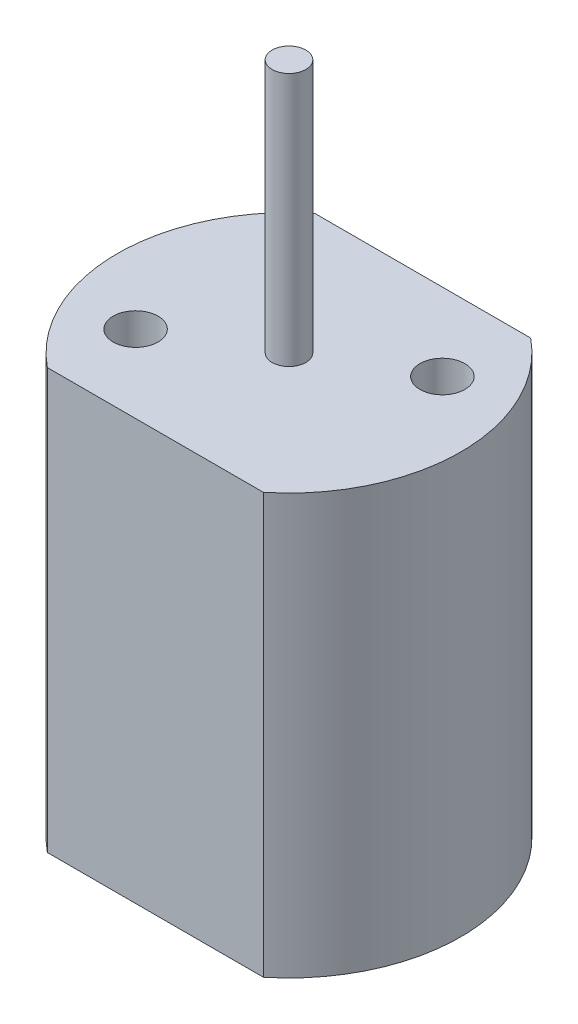
ISO-10303-21;
HEADER;
FILE_DESCRIPTION(('STEP AP214'),'2;1');
FILE_NAME('part.step','',(''),(''),'','','');
FILE_SCHEMA(('AUTOMOTIVE_DESIGN { 1 0 10303 214 1 1 1 1 }'));
ENDSEC;
DATA;
#1=APPLICATION_CONTEXT('core data for automotive mechanical design processes');
#2=APPLICATION_PROTOCOL_DEFINITION('international standard','automotive_design',2000,#1);
#3=PRODUCT_CONTEXT('',#1,'mechanical');
#4=PRODUCT('Part','Part','',(#3));
#5=PRODUCT_RELATED_PRODUCT_CATEGORY('part','',(#4));
#6=PRODUCT_DEFINITION_FORMATION('','',#4);
#7=PRODUCT_DEFINITION_CONTEXT('part definition',#1,'design');
#8=PRODUCT_DEFINITION('design','',#6,#7);
#9=PRODUCT_DEFINITION_SHAPE('','',#8);
#10=(LENGTH_UNIT() NAMED_UNIT(*) SI_UNIT(.MILLI.,.METRE.));
#11=(NAMED_UNIT(*) PLANE_ANGLE_UNIT() SI_UNIT($,.RADIAN.));
#12=(NAMED_UNIT(*) SI_UNIT($,.STERADIAN.) SOLID_ANGLE_UNIT());
#13=UNCERTAINTY_MEASURE_WITH_UNIT(LENGTH_MEASURE(1.E-05),#10,'distance_accuracy_value','');
#14=(GEOMETRIC_REPRESENTATION_CONTEXT(3) GLOBAL_UNCERTAINTY_ASSIGNED_CONTEXT((#13)) GLOBAL_UNIT_ASSIGNED_CONTEXT((#10,
#11,#12)) REPRESENTATION_CONTEXT('',''));
#15=CARTESIAN_POINT('',(0.,0.,0.));
#16=DIRECTION('',(0.,0.,1.));
#17=DIRECTION('',(1.,0.,0.));
#18=AXIS2_PLACEMENT_3D('',#15,#16,#17);
#19=CARTESIAN_POINT('',(0.,18.7,0.));
#20=DIRECTION('',(0.,-1.,0.));
#21=DIRECTION('',(0.,0.,-1.));
#22=AXIS2_PLACEMENT_3D('',#19,#20,#21);
#23=CYLINDRICAL_SURFACE('',#22,7.65);
#24=CARTESIAN_POINT('',(0.,0.,0.));
#25=DIRECTION('',(0.,1.,0.));
#26=DIRECTION('',(0.,0.,1.));
#27=AXIS2_PLACEMENT_3D('',#24,#25,#26);
#28=CIRCLE('',#27,7.65);
#29=CARTESIAN_POINT('',(4.80832611206852,0.,5.95));
#30=VERTEX_POINT('',#29);
#31=CARTESIAN_POINT('',(4.80832611206852,0.,-5.95));
#32=VERTEX_POINT('',#31);
#33=EDGE_CURVE('E112',#30,#32,#28,.T.);
#34=ORIENTED_EDGE('',*,*,#33,.T.);
#35=DIRECTION('',(0.,-1.,0.));
#36=VECTOR('',#35,1.);
#37=CARTESIAN_POINT('',(4.80832611206852,18.7,-5.95));
#38=LINE('',#37,#36);
#39=CARTESIAN_POINT('',(4.80832611206852,18.7,-5.95));
#40=VERTEX_POINT('',#39);
#41=EDGE_CURVE('E11',#40,#32,#38,.T.);
#42=ORIENTED_EDGE('',*,*,#41,.F.);
#43=CARTESIAN_POINT('',(0.,18.7,0.));
#44=DIRECTION('',(0.,1.,0.));
#45=DIRECTION('',(0.,0.,1.));
#46=AXIS2_PLACEMENT_3D('',#43,#44,#45);
#47=CIRCLE('',#46,7.65);
#48=CARTESIAN_POINT('',(4.80832611206852,18.7,5.95));
#49=VERTEX_POINT('',#48);
#50=EDGE_CURVE('E96',#49,#40,#47,.T.);
#51=ORIENTED_EDGE('',*,*,#50,.F.);
#52=DIRECTION('',(0.,-1.,0.));
#53=VECTOR('',#52,1.);
#54=CARTESIAN_POINT('',(4.80832611206852,18.7,5.95));
#55=LINE('',#54,#53);
#56=EDGE_CURVE('E108',#49,#30,#55,.T.);
#57=ORIENTED_EDGE('',*,*,#56,.T.);
#58=EDGE_LOOP('',(#34,#42,#51,#57));
#59=FACE_BOUND('',#58,.T.);
#60=ADVANCED_FACE('F44',(#59),#23,.T.);
#61=CARTESIAN_POINT('',(4.80832611206852,18.7,-5.95));
#62=DIRECTION('',(0.,0.,1.));
#63=DIRECTION('',(1.,0.,0.));
#64=AXIS2_PLACEMENT_3D('',#61,#62,#63);
#65=PLANE('',#64);
#66=DIRECTION('',(-1.,0.,0.));
#67=VECTOR('',#66,1.);
#68=CARTESIAN_POINT('',(4.80832611206852,0.,-5.95));
#69=LINE('',#68,#67);
#70=CARTESIAN_POINT('',(-4.80832611206852,0.,-5.95));
#71=VERTEX_POINT('',#70);
#72=EDGE_CURVE('E101',#32,#71,#69,.T.);
#73=ORIENTED_EDGE('',*,*,#72,.T.);
#74=DIRECTION('',(0.,-1.,0.));
#75=VECTOR('',#74,1.);
#76=CARTESIAN_POINT('',(-4.80832611206852,18.7,-5.95));
#77=LINE('',#76,#75);
#78=CARTESIAN_POINT('',(-4.80832611206852,18.7,-5.95));
#79=VERTEX_POINT('',#78);
#80=EDGE_CURVE('E53',#79,#71,#77,.T.);
#81=ORIENTED_EDGE('',*,*,#80,.F.);
#82=DIRECTION('',(-1.,0.,0.));
#83=VECTOR('',#82,1.);
#84=CARTESIAN_POINT('',(4.80832611206852,18.7,-5.95));
#85=LINE('',#84,#83);
#86=EDGE_CURVE('E91',#40,#79,#85,.T.);
#87=ORIENTED_EDGE('',*,*,#86,.F.);
#88=ORIENTED_EDGE('',*,*,#41,.T.);
#89=EDGE_LOOP('',(#73,#81,#87,#88));
#90=FACE_BOUND('',#89,.T.);
#91=ADVANCED_FACE('F100',(#90),#65,.F.);
#92=CARTESIAN_POINT('',(0.,18.7,0.));
#93=DIRECTION('',(0.,-1.,0.));
#94=DIRECTION('',(0.,0.,-1.));
#95=AXIS2_PLACEMENT_3D('',#92,#93,#94);
#96=CYLINDRICAL_SURFACE('',#95,7.65);
#97=CARTESIAN_POINT('',(0.,0.,0.));
#98=DIRECTION('',(0.,1.,0.));
#99=DIRECTION('',(0.,0.,1.));
#100=AXIS2_PLACEMENT_3D('',#97,#98,#99);
#101=CIRCLE('',#100,7.65);
#102=CARTESIAN_POINT('',(-4.80832611206852,0.,5.95));
#103=VERTEX_POINT('',#102);
#104=EDGE_CURVE('E78',#71,#103,#101,.T.);
#105=ORIENTED_EDGE('',*,*,#104,.T.);
#106=DIRECTION('',(0.,-1.,0.));
#107=VECTOR('',#106,1.);
#108=CARTESIAN_POINT('',(-4.80832611206852,18.7,5.95));
#109=LINE('',#108,#107);
#110=CARTESIAN_POINT('',(-4.80832611206852,18.7,5.95));
#111=VERTEX_POINT('',#110);
#112=EDGE_CURVE('E103',#111,#103,#109,.T.);
#113=ORIENTED_EDGE('',*,*,#112,.F.);
#114=CARTESIAN_POINT('',(0.,18.7,0.));
#115=DIRECTION('',(0.,1.,0.));
#116=DIRECTION('',(0.,0.,1.));
#117=AXIS2_PLACEMENT_3D('',#114,#115,#116);
#118=CIRCLE('',#117,7.65);
#119=EDGE_CURVE('E94',#79,#111,#118,.T.);
#120=ORIENTED_EDGE('',*,*,#119,.F.);
#121=ORIENTED_EDGE('',*,*,#80,.T.);
#122=EDGE_LOOP('',(#105,#113,#120,#121));
#123=FACE_BOUND('',#122,.T.);
#124=ADVANCED_FACE('F104',(#123),#96,.T.);
#125=CARTESIAN_POINT('',(4.80832611206852,18.7,5.95));
#126=DIRECTION('',(0.,0.,-1.));
#127=DIRECTION('',(-1.,0.,0.));
#128=AXIS2_PLACEMENT_3D('',#125,#126,#127);
#129=PLANE('',#128);
#130=DIRECTION('',(1.,0.,0.));
#131=VECTOR('',#130,1.);
#132=CARTESIAN_POINT('',(4.80832611206852,0.,5.95));
#133=LINE('',#132,#131);
#134=EDGE_CURVE('E84',#103,#30,#133,.T.);
#135=ORIENTED_EDGE('',*,*,#134,.T.);
#136=ORIENTED_EDGE('',*,*,#56,.F.);
#137=DIRECTION('',(1.,0.,0.));
#138=VECTOR('',#137,1.);
#139=CARTESIAN_POINT('',(4.80832611206852,18.7,5.95));
#140=LINE('',#139,#138);
#141=EDGE_CURVE('E61',#111,#49,#140,.T.);
#142=ORIENTED_EDGE('',*,*,#141,.F.);
#143=ORIENTED_EDGE('',*,*,#112,.T.);
#144=EDGE_LOOP('',(#135,#136,#142,#143));
#145=FACE_BOUND('',#144,.T.);
#146=ADVANCED_FACE('F126',(#145),#129,.F.);
#147=CARTESIAN_POINT('',(0.,18.7,0.));
#148=DIRECTION('',(0.,1.,0.));
#149=DIRECTION('',(0.,0.,1.));
#150=AXIS2_PLACEMENT_3D('',#147,#148,#149);
#151=PLANE('',#150);
#152=CARTESIAN_POINT('',(4.33012701892221,18.7,-2.49999999999998));
#153=DIRECTION('',(0.,1.,0.));
#154=DIRECTION('',(0.,0.,1.));
#155=AXIS2_PLACEMENT_3D('',#152,#153,#154);
#156=CIRCLE('',#155,0.999999999999996);
#157=CARTESIAN_POINT('',(4.33012701892221,18.7,-1.49999999999998));
#158=VERTEX_POINT('',#157);
#159=EDGE_CURVE('E149',#158,#158,#156,.T.);
#160=ORIENTED_EDGE('',*,*,#159,.F.);
#161=EDGE_LOOP('',(#160));
#162=FACE_BOUND('',#161,.T.);
#163=CARTESIAN_POINT('',(-4.33012701892221,18.7,2.49999999999998));
#164=DIRECTION('',(0.,1.,0.));
#165=DIRECTION('',(0.,0.,1.));
#166=AXIS2_PLACEMENT_3D('',#163,#164,#165);
#167=CIRCLE('',#166,0.999999999999995);
#168=CARTESIAN_POINT('',(-4.33012701892221,18.7,3.49999999999997));
#169=VERTEX_POINT('',#168);
#170=EDGE_CURVE('E145',#169,#169,#167,.T.);
#171=ORIENTED_EDGE('',*,*,#170,.F.);
#172=EDGE_LOOP('',(#171));
#173=FACE_BOUND('',#172,.T.);
#174=CARTESIAN_POINT('',(0.,18.7,0.));
#175=DIRECTION('',(0.,1.,0.));
#176=DIRECTION('',(0.,0.,1.));
#177=AXIS2_PLACEMENT_3D('',#174,#175,#176);
#178=CIRCLE('',#177,0.75);
#179=CARTESIAN_POINT('',(0.,18.7,0.75));
#180=VERTEX_POINT('',#179);
#181=EDGE_CURVE('E133',#180,#180,#178,.T.);
#182=ORIENTED_EDGE('',*,*,#181,.F.);
#183=EDGE_LOOP('',(#182));
#184=FACE_BOUND('',#183,.T.);
#185=ORIENTED_EDGE('',*,*,#50,.T.);
#186=ORIENTED_EDGE('',*,*,#86,.T.);
#187=ORIENTED_EDGE('',*,*,#119,.T.);
#188=ORIENTED_EDGE('',*,*,#141,.T.);
#189=EDGE_LOOP('',(#185,#186,#187,#188));
#190=FACE_BOUND('',#189,.T.);
#191=ADVANCED_FACE('F92',(#162,#173,#184,#190),#151,.T.);
#192=CARTESIAN_POINT('',(0.,0.,0.));
#193=DIRECTION('',(0.,1.,0.));
#194=DIRECTION('',(0.,0.,1.));
#195=AXIS2_PLACEMENT_3D('',#192,#193,#194);
#196=PLANE('',#195);
#197=ORIENTED_EDGE('',*,*,#33,.F.);
#198=ORIENTED_EDGE('',*,*,#134,.F.);
#199=ORIENTED_EDGE('',*,*,#104,.F.);
#200=ORIENTED_EDGE('',*,*,#72,.F.);
#201=EDGE_LOOP('',(#197,#198,#199,#200));
#202=FACE_BOUND('',#201,.T.);
#203=ADVANCED_FACE('F129',(#202),#196,.F.);
#204=CARTESIAN_POINT('',(0.,30.,0.));
#205=DIRECTION('',(0.,-1.,0.));
#206=DIRECTION('',(0.,0.,-1.));
#207=AXIS2_PLACEMENT_3D('',#204,#205,#206);
#208=CYLINDRICAL_SURFACE('',#207,0.75);
#209=CARTESIAN_POINT('',(0.,30.,0.));
#210=DIRECTION('',(0.,1.,0.));
#211=DIRECTION('',(0.,0.,1.));
#212=AXIS2_PLACEMENT_3D('',#209,#210,#211);
#213=CIRCLE('',#212,0.75);
#214=CARTESIAN_POINT('',(0.,30.,0.75));
#215=VERTEX_POINT('',#214);
#216=EDGE_CURVE('E116',#215,#215,#213,.T.);
#217=ORIENTED_EDGE('',*,*,#216,.F.);
#218=EDGE_LOOP('',(#217));
#219=FACE_BOUND('',#218,.T.);
#220=ORIENTED_EDGE('',*,*,#181,.T.);
#221=EDGE_LOOP('',(#220));
#222=FACE_BOUND('',#221,.T.);
#223=ADVANCED_FACE('F173',(#219,#222),#208,.T.);
#224=CARTESIAN_POINT('',(0.,30.,0.));
#225=DIRECTION('',(0.,1.,0.));
#226=DIRECTION('',(0.,0.,1.));
#227=AXIS2_PLACEMENT_3D('',#224,#225,#226);
#228=PLANE('',#227);
#229=ORIENTED_EDGE('',*,*,#216,.T.);
#230=EDGE_LOOP('',(#229));
#231=FACE_BOUND('',#230,.T.);
#232=ADVANCED_FACE('F175',(#231),#228,.T.);
#233=CARTESIAN_POINT('',(-4.33012701892221,15.7,2.49999999999998));
#234=DIRECTION('',(0.,1.,0.));
#235=DIRECTION('',(0.,0.,1.));
#236=AXIS2_PLACEMENT_3D('',#233,#234,#235);
#237=CYLINDRICAL_SURFACE('',#236,0.999999999999995);
#238=CARTESIAN_POINT('',(-4.33012701892221,15.7,2.49999999999998));
#239=DIRECTION('',(0.,1.,0.));
#240=DIRECTION('',(0.,0.,1.));
#241=AXIS2_PLACEMENT_3D('',#238,#239,#240);
#242=CIRCLE('',#241,0.999999999999995);
#243=CARTESIAN_POINT('',(-4.33012701892221,15.7,3.49999999999997));
#244=VERTEX_POINT('',#243);
#245=EDGE_CURVE('E141',#244,#244,#242,.T.);
#246=ORIENTED_EDGE('',*,*,#245,.F.);
#247=EDGE_LOOP('',(#246));
#248=FACE_BOUND('',#247,.T.);
#249=ORIENTED_EDGE('',*,*,#170,.T.);
#250=EDGE_LOOP('',(#249));
#251=FACE_BOUND('',#250,.T.);
#252=ADVANCED_FACE('F182',(#248,#251),#237,.F.);
#253=CARTESIAN_POINT('',(-4.33012701892221,15.7,2.49999999999998));
#254=DIRECTION('',(0.,1.,0.));
#255=DIRECTION('',(0.,0.,1.));
#256=AXIS2_PLACEMENT_3D('',#253,#254,#255);
#257=PLANE('',#256);
#258=ORIENTED_EDGE('',*,*,#245,.T.);
#259=EDGE_LOOP('',(#258));
#260=FACE_BOUND('',#259,.T.);
#261=ADVANCED_FACE('F162',(#260),#257,.T.);
#262=CARTESIAN_POINT('',(4.33012701892221,15.7,-2.49999999999998));
#263=DIRECTION('',(0.,1.,0.));
#264=DIRECTION('',(0.,0.,1.));
#265=AXIS2_PLACEMENT_3D('',#262,#263,#264);
#266=CYLINDRICAL_SURFACE('',#265,0.999999999999996);
#267=CARTESIAN_POINT('',(4.33012701892221,15.7,-2.49999999999998));
#268=DIRECTION('',(0.,1.,0.));
#269=DIRECTION('',(0.,0.,1.));
#270=AXIS2_PLACEMENT_3D('',#267,#268,#269);
#271=CIRCLE('',#270,0.999999999999996);
#272=CARTESIAN_POINT('',(4.33012701892221,15.7,-1.49999999999998));
#273=VERTEX_POINT('',#272);
#274=EDGE_CURVE('E137',#273,#273,#271,.T.);
#275=ORIENTED_EDGE('',*,*,#274,.F.);
#276=EDGE_LOOP('',(#275));
#277=FACE_BOUND('',#276,.T.);
#278=ORIENTED_EDGE('',*,*,#159,.T.);
#279=EDGE_LOOP('',(#278));
#280=FACE_BOUND('',#279,.T.);
#281=ADVANCED_FACE('F159',(#277,#280),#266,.F.);
#282=CARTESIAN_POINT('',(4.33012701892221,15.7,-2.49999999999998));
#283=DIRECTION('',(0.,1.,0.));
#284=DIRECTION('',(0.,0.,1.));
#285=AXIS2_PLACEMENT_3D('',#282,#283,#284);
#286=PLANE('',#285);
#287=ORIENTED_EDGE('',*,*,#274,.T.);
#288=EDGE_LOOP('',(#287));
#289=FACE_BOUND('',#288,.T.);
#290=ADVANCED_FACE('F157',(#289),#286,.T.);
#291=CLOSED_SHELL('',(#60,#91,#124,#146,#191,#203,#223,#232,#252,#261,#281,#290));
#292=MANIFOLD_SOLID_BREP('B2',#291);
#293=ADVANCED_BREP_SHAPE_REPRESENTATION('',(#18,#292),#14);
#294=SHAPE_DEFINITION_REPRESENTATION(#9,#293);
ENDSEC;
END-ISO-10303-21;
